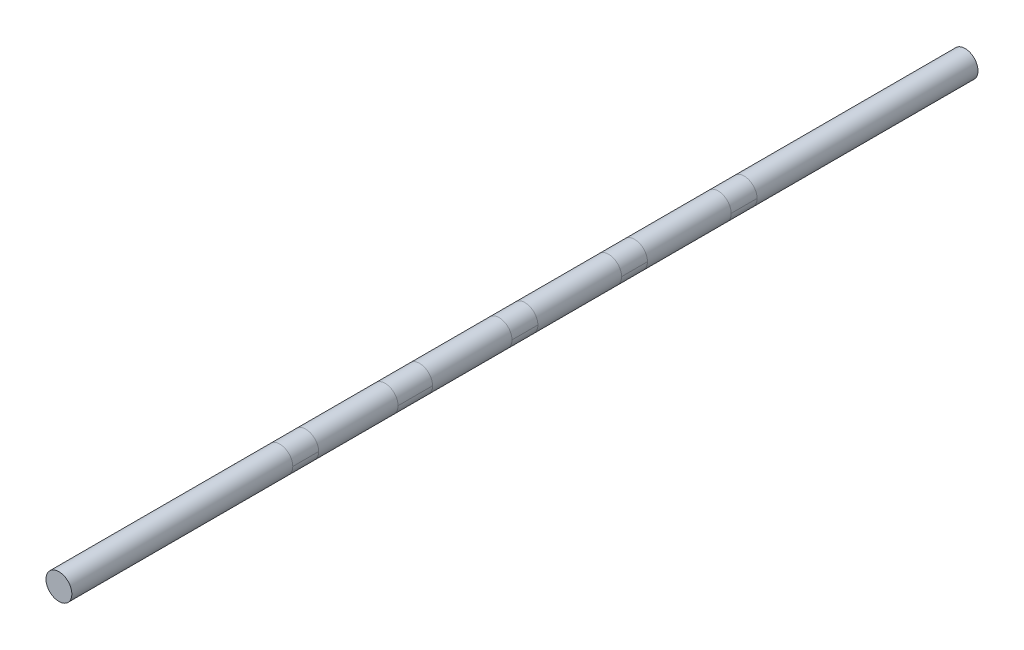
ISO-10303-21;
HEADER;
FILE_DESCRIPTION(('STEP AP214'),'2;1');
FILE_NAME('part.step','',(''),(''),'','','');
FILE_SCHEMA(('AUTOMOTIVE_DESIGN { 1 0 10303 214 1 1 1 1 }'));
ENDSEC;
DATA;
#1=APPLICATION_CONTEXT('core data for automotive mechanical design processes');
#2=APPLICATION_PROTOCOL_DEFINITION('international standard','automotive_design',2000,#1);
#3=PRODUCT_CONTEXT('',#1,'mechanical');
#4=PRODUCT('Part','Part','',(#3));
#5=PRODUCT_RELATED_PRODUCT_CATEGORY('part','',(#4));
#6=PRODUCT_DEFINITION_FORMATION('','',#4);
#7=PRODUCT_DEFINITION_CONTEXT('part definition',#1,'design');
#8=PRODUCT_DEFINITION('design','',#6,#7);
#9=PRODUCT_DEFINITION_SHAPE('','',#8);
#10=(LENGTH_UNIT() NAMED_UNIT(*) SI_UNIT(.MILLI.,.METRE.));
#11=(NAMED_UNIT(*) PLANE_ANGLE_UNIT() SI_UNIT($,.RADIAN.));
#12=(NAMED_UNIT(*) SI_UNIT($,.STERADIAN.) SOLID_ANGLE_UNIT());
#13=UNCERTAINTY_MEASURE_WITH_UNIT(LENGTH_MEASURE(1.E-05),#10,'distance_accuracy_value','');
#14=(GEOMETRIC_REPRESENTATION_CONTEXT(3) GLOBAL_UNCERTAINTY_ASSIGNED_CONTEXT((#13)) GLOBAL_UNIT_ASSIGNED_CONTEXT((#10,
#11,#12)) REPRESENTATION_CONTEXT('',''));
#15=CARTESIAN_POINT('',(0.,0.,0.));
#16=DIRECTION('',(0.,0.,1.));
#17=DIRECTION('',(1.,0.,0.));
#18=AXIS2_PLACEMENT_3D('',#15,#16,#17);
#19=CARTESIAN_POINT('',(0.,0.,1050.));
#20=DIRECTION('',(0.,0.,-1.));
#21=DIRECTION('',(-1.,0.,0.));
#22=AXIS2_PLACEMENT_3D('',#19,#20,#21);
#23=CYLINDRICAL_SURFACE('',#22,14.986);
#24=DIRECTION('',(0.,0.,-1.));
#25=VECTOR('',#24,1.);
#26=CARTESIAN_POINT('',(14.986,0.,1050.));
#27=LINE('',#26,#25);
#28=CARTESIAN_POINT('',(14.986,0.,286.));
#29=VERTEX_POINT('',#28);
#30=CARTESIAN_POINT('',(14.986,0.,256.));
#31=VERTEX_POINT('',#30);
#32=EDGE_CURVE('E11',#29,#31,#27,.T.);
#33=ORIENTED_EDGE('',*,*,#32,.F.);
#34=CARTESIAN_POINT('',(0.,0.,286.));
#35=DIRECTION('',(0.,0.,-1.));
#36=DIRECTION('',(-1.,0.,0.));
#37=AXIS2_PLACEMENT_3D('',#34,#35,#36);
#38=CIRCLE('',#37,14.986);
#39=CARTESIAN_POINT('',(-14.986,0.,286.));
#40=VERTEX_POINT('',#39);
#41=EDGE_CURVE('E50',#29,#40,#38,.T.);
#42=ORIENTED_EDGE('',*,*,#41,.T.);
#43=DIRECTION('',(0.,0.,-1.));
#44=VECTOR('',#43,1.);
#45=CARTESIAN_POINT('',(-14.9859999999999,0.,1050.));
#46=LINE('',#45,#44);
#47=CARTESIAN_POINT('',(-14.9859999999999,0.,256.));
#48=VERTEX_POINT('',#47);
#49=EDGE_CURVE('E207',#40,#48,#46,.T.);
#50=ORIENTED_EDGE('',*,*,#49,.T.);
#51=CARTESIAN_POINT('',(0.,0.,256.));
#52=DIRECTION('',(0.,0.,1.));
#53=DIRECTION('',(1.,0.,0.));
#54=AXIS2_PLACEMENT_3D('',#51,#52,#53);
#55=CIRCLE('',#54,14.986);
#56=EDGE_CURVE('E201',#48,#31,#55,.T.);
#57=ORIENTED_EDGE('',*,*,#56,.T.);
#58=EDGE_LOOP('',(#33,#42,#50,#57));
#59=FACE_BOUND('',#58,.T.);
#60=ADVANCED_FACE('F43',(#59),#23,.T.);
#61=CARTESIAN_POINT('',(0.,0.,0.));
#62=DIRECTION('',(0.,0.,1.));
#63=DIRECTION('',(1.,0.,0.));
#64=AXIS2_PLACEMENT_3D('',#61,#62,#63);
#65=CIRCLE('',#64,14.986);
#66=CARTESIAN_POINT('',(14.986,0.,0.));
#67=VERTEX_POINT('',#66);
#68=EDGE_CURVE('E149',#67,#67,#65,.T.);
#69=ORIENTED_EDGE('',*,*,#68,.T.);
#70=EDGE_LOOP('',(#69));
#71=FACE_BOUND('',#70,.T.);
#72=EDGE_CURVE('E52',#31,#48,#55,.T.);
#73=ORIENTED_EDGE('',*,*,#72,.F.);
#74=ORIENTED_EDGE('',*,*,#56,.F.);
#75=EDGE_LOOP('',(#73,#74));
#76=FACE_BOUND('',#75,.T.);
#77=ADVANCED_FACE('F226',(#71,#76),#23,.T.);
#78=CARTESIAN_POINT('',(0.,0.,383.));
#79=DIRECTION('',(0.,0.,1.));
#80=DIRECTION('',(1.,0.,0.));
#81=AXIS2_PLACEMENT_3D('',#78,#79,#80);
#82=CIRCLE('',#81,14.986);
#83=CARTESIAN_POINT('',(14.986,0.,383.));
#84=VERTEX_POINT('',#83);
#85=CARTESIAN_POINT('',(-14.986,0.,383.));
#86=VERTEX_POINT('',#85);
#87=EDGE_CURVE('E127',#84,#86,#82,.T.);
#88=ORIENTED_EDGE('',*,*,#87,.F.);
#89=EDGE_CURVE('E123',#86,#84,#82,.T.);
#90=ORIENTED_EDGE('',*,*,#89,.F.);
#91=EDGE_LOOP('',(#88,#90));
#92=FACE_BOUND('',#91,.T.);
#93=EDGE_CURVE('E209',#40,#29,#38,.T.);
#94=ORIENTED_EDGE('',*,*,#93,.F.);
#95=ORIENTED_EDGE('',*,*,#41,.F.);
#96=EDGE_LOOP('',(#94,#95));
#97=FACE_BOUND('',#96,.T.);
#98=ADVANCED_FACE('F222',(#92,#97),#23,.T.);
#99=DIRECTION('',(0.,0.,-1.));
#100=VECTOR('',#99,1.);
#101=CARTESIAN_POINT('',(14.986,0.,1050.));
#102=LINE('',#101,#100);
#103=CARTESIAN_POINT('',(14.986,0.,672.));
#104=VERTEX_POINT('',#103);
#105=CARTESIAN_POINT('',(14.986,0.,632.));
#106=VERTEX_POINT('',#105);
#107=EDGE_CURVE('E190',#104,#106,#102,.T.);
#108=ORIENTED_EDGE('',*,*,#107,.F.);
#109=CARTESIAN_POINT('',(0.,0.,672.));
#110=DIRECTION('',(0.,0.,-1.));
#111=DIRECTION('',(-1.,0.,0.));
#112=AXIS2_PLACEMENT_3D('',#109,#110,#111);
#113=CIRCLE('',#112,14.986);
#114=CARTESIAN_POINT('',(-14.986,0.,672.));
#115=VERTEX_POINT('',#114);
#116=EDGE_CURVE('E173',#104,#115,#113,.T.);
#117=ORIENTED_EDGE('',*,*,#116,.T.);
#118=DIRECTION('',(0.,0.,-1.));
#119=VECTOR('',#118,1.);
#120=CARTESIAN_POINT('',(-14.986,0.,1050.));
#121=LINE('',#120,#119);
#122=CARTESIAN_POINT('',(-14.986,0.,632.));
#123=VERTEX_POINT('',#122);
#124=EDGE_CURVE('E192',#115,#123,#121,.T.);
#125=ORIENTED_EDGE('',*,*,#124,.T.);
#126=CARTESIAN_POINT('',(0.,0.,632.));
#127=DIRECTION('',(0.,0.,1.));
#128=DIRECTION('',(1.,0.,0.));
#129=AXIS2_PLACEMENT_3D('',#126,#127,#128);
#130=CIRCLE('',#129,14.986);
#131=EDGE_CURVE('E194',#123,#106,#130,.T.);
#132=ORIENTED_EDGE('',*,*,#131,.T.);
#133=EDGE_LOOP('',(#108,#117,#125,#132));
#134=FACE_BOUND('',#133,.T.);
#135=ADVANCED_FACE('F227',(#134),#23,.T.);
#136=CARTESIAN_POINT('',(0.,0.,540.));
#137=DIRECTION('',(0.,0.,-1.));
#138=DIRECTION('',(-1.,0.,0.));
#139=AXIS2_PLACEMENT_3D('',#136,#137,#138);
#140=CIRCLE('',#139,14.986);
#141=CARTESIAN_POINT('',(-14.986,0.,540.));
#142=VERTEX_POINT('',#141);
#143=CARTESIAN_POINT('',(14.986,0.,540.));
#144=VERTEX_POINT('',#143);
#145=EDGE_CURVE('E158',#142,#144,#140,.T.);
#146=ORIENTED_EDGE('',*,*,#145,.F.);
#147=EDGE_CURVE('E128',#144,#142,#140,.T.);
#148=ORIENTED_EDGE('',*,*,#147,.F.);
#149=EDGE_LOOP('',(#146,#148));
#150=FACE_BOUND('',#149,.T.);
#151=EDGE_CURVE('E188',#106,#123,#130,.T.);
#152=ORIENTED_EDGE('',*,*,#151,.F.);
#153=ORIENTED_EDGE('',*,*,#131,.F.);
#154=EDGE_LOOP('',(#152,#153));
#155=FACE_BOUND('',#154,.T.);
#156=ADVANCED_FACE('F234',(#150,#155),#23,.T.);
#157=CARTESIAN_POINT('',(0.,0.,764.));
#158=DIRECTION('',(0.,0.,1.));
#159=DIRECTION('',(1.,0.,0.));
#160=AXIS2_PLACEMENT_3D('',#157,#158,#159);
#161=CIRCLE('',#160,14.986);
#162=CARTESIAN_POINT('',(14.986,0.,764.));
#163=VERTEX_POINT('',#162);
#164=CARTESIAN_POINT('',(-14.986,0.,764.));
#165=VERTEX_POINT('',#164);
#166=EDGE_CURVE('E172',#163,#165,#161,.T.);
#167=ORIENTED_EDGE('',*,*,#166,.F.);
#168=EDGE_CURVE('E174',#165,#163,#161,.T.);
#169=ORIENTED_EDGE('',*,*,#168,.F.);
#170=EDGE_LOOP('',(#167,#169));
#171=FACE_BOUND('',#170,.T.);
#172=EDGE_CURVE('E197',#115,#104,#113,.T.);
#173=ORIENTED_EDGE('',*,*,#172,.F.);
#174=ORIENTED_EDGE('',*,*,#116,.F.);
#175=EDGE_LOOP('',(#173,#174));
#176=FACE_BOUND('',#175,.T.);
#177=ADVANCED_FACE('F311',(#171,#176),#23,.T.);
#178=DIRECTION('',(0.,0.,-1.));
#179=VECTOR('',#178,1.);
#180=CARTESIAN_POINT('',(14.986,0.,1050.));
#181=LINE('',#180,#179);
#182=CARTESIAN_POINT('',(14.986,0.,794.));
#183=VERTEX_POINT('',#182);
#184=EDGE_CURVE('E167',#183,#163,#181,.T.);
#185=ORIENTED_EDGE('',*,*,#184,.F.);
#186=CARTESIAN_POINT('',(0.,0.,794.));
#187=DIRECTION('',(0.,0.,-1.));
#188=DIRECTION('',(-1.,0.,0.));
#189=AXIS2_PLACEMENT_3D('',#186,#187,#188);
#190=CIRCLE('',#189,14.986);
#191=CARTESIAN_POINT('',(-14.986,0.,794.));
#192=VERTEX_POINT('',#191);
#193=EDGE_CURVE('E169',#183,#192,#190,.T.);
#194=ORIENTED_EDGE('',*,*,#193,.T.);
#195=DIRECTION('',(0.,0.,-1.));
#196=VECTOR('',#195,1.);
#197=CARTESIAN_POINT('',(-14.986,0.,1050.));
#198=LINE('',#197,#196);
#199=EDGE_CURVE('E177',#192,#165,#198,.T.);
#200=ORIENTED_EDGE('',*,*,#199,.T.);
#201=ORIENTED_EDGE('',*,*,#168,.T.);
#202=EDGE_LOOP('',(#185,#194,#200,#201));
#203=FACE_BOUND('',#202,.T.);
#204=ADVANCED_FACE('F299',(#203),#23,.T.);
#205=ORIENTED_EDGE('',*,*,#172,.T.);
#206=ORIENTED_EDGE('',*,*,#107,.T.);
#207=ORIENTED_EDGE('',*,*,#151,.T.);
#208=ORIENTED_EDGE('',*,*,#124,.F.);
#209=EDGE_LOOP('',(#205,#206,#207,#208));
#210=FACE_BOUND('',#209,.T.);
#211=ADVANCED_FACE('F295',(#210),#23,.T.);
#212=CARTESIAN_POINT('',(0.,0.,1050.));
#213=DIRECTION('',(0.,0.,1.));
#214=DIRECTION('',(1.,0.,0.));
#215=AXIS2_PLACEMENT_3D('',#212,#213,#214);
#216=CIRCLE('',#215,14.986);
#217=CARTESIAN_POINT('',(14.986,0.,1050.));
#218=VERTEX_POINT('',#217);
#219=EDGE_CURVE('E142',#218,#218,#216,.T.);
#220=ORIENTED_EDGE('',*,*,#219,.F.);
#221=EDGE_LOOP('',(#220));
#222=FACE_BOUND('',#221,.T.);
#223=EDGE_CURVE('E182',#192,#183,#190,.T.);
#224=ORIENTED_EDGE('',*,*,#223,.F.);
#225=ORIENTED_EDGE('',*,*,#193,.F.);
#226=EDGE_LOOP('',(#224,#225));
#227=FACE_BOUND('',#226,.T.);
#228=ADVANCED_FACE('F287',(#222,#227),#23,.T.);
#229=DIRECTION('',(0.,0.,-1.));
#230=VECTOR('',#229,1.);
#231=CARTESIAN_POINT('',(14.986,0.,1050.));
#232=LINE('',#231,#230);
#233=CARTESIAN_POINT('',(14.986,0.,510.));
#234=VERTEX_POINT('',#233);
#235=EDGE_CURVE('E168',#144,#234,#232,.T.);
#236=ORIENTED_EDGE('',*,*,#235,.F.);
#237=ORIENTED_EDGE('',*,*,#147,.T.);
#238=DIRECTION('',(0.,0.,-1.));
#239=VECTOR('',#238,1.);
#240=CARTESIAN_POINT('',(-14.986,0.,1050.));
#241=LINE('',#240,#239);
#242=CARTESIAN_POINT('',(-14.986,0.,510.));
#243=VERTEX_POINT('',#242);
#244=EDGE_CURVE('E160',#142,#243,#241,.T.);
#245=ORIENTED_EDGE('',*,*,#244,.T.);
#246=CARTESIAN_POINT('',(0.,0.,510.));
#247=DIRECTION('',(0.,0.,1.));
#248=DIRECTION('',(1.,0.,0.));
#249=AXIS2_PLACEMENT_3D('',#246,#247,#248);
#250=CIRCLE('',#249,14.986);
#251=EDGE_CURVE('E163',#243,#234,#250,.T.);
#252=ORIENTED_EDGE('',*,*,#251,.T.);
#253=EDGE_LOOP('',(#236,#237,#245,#252));
#254=FACE_BOUND('',#253,.T.);
#255=ADVANCED_FACE('F262',(#254),#23,.T.);
#256=CARTESIAN_POINT('',(0.,0.,413.));
#257=DIRECTION('',(0.,0.,-1.));
#258=DIRECTION('',(-1.,0.,0.));
#259=AXIS2_PLACEMENT_3D('',#256,#257,#258);
#260=CIRCLE('',#259,14.986);
#261=CARTESIAN_POINT('',(-14.986,0.,413.));
#262=VERTEX_POINT('',#261);
#263=CARTESIAN_POINT('',(14.986,0.,413.));
#264=VERTEX_POINT('',#263);
#265=EDGE_CURVE('E131',#262,#264,#260,.T.);
#266=ORIENTED_EDGE('',*,*,#265,.F.);
#267=EDGE_CURVE('E124',#264,#262,#260,.T.);
#268=ORIENTED_EDGE('',*,*,#267,.F.);
#269=EDGE_LOOP('',(#266,#268));
#270=FACE_BOUND('',#269,.T.);
#271=EDGE_CURVE('E164',#234,#243,#250,.T.);
#272=ORIENTED_EDGE('',*,*,#271,.F.);
#273=ORIENTED_EDGE('',*,*,#251,.F.);
#274=EDGE_LOOP('',(#272,#273));
#275=FACE_BOUND('',#274,.T.);
#276=ADVANCED_FACE('F136',(#270,#275),#23,.T.);
#277=ORIENTED_EDGE('',*,*,#223,.T.);
#278=ORIENTED_EDGE('',*,*,#184,.T.);
#279=ORIENTED_EDGE('',*,*,#166,.T.);
#280=ORIENTED_EDGE('',*,*,#199,.F.);
#281=EDGE_LOOP('',(#277,#278,#279,#280));
#282=FACE_BOUND('',#281,.T.);
#283=ADVANCED_FACE('F282',(#282),#23,.T.);
#284=DIRECTION('',(0.,0.,-1.));
#285=VECTOR('',#284,1.);
#286=CARTESIAN_POINT('',(14.986,0.,1050.));
#287=LINE('',#286,#285);
#288=EDGE_CURVE('E117',#264,#84,#287,.T.);
#289=ORIENTED_EDGE('',*,*,#288,.F.);
#290=ORIENTED_EDGE('',*,*,#267,.T.);
#291=DIRECTION('',(0.,0.,-1.));
#292=VECTOR('',#291,1.);
#293=CARTESIAN_POINT('',(-14.986,0.,1050.));
#294=LINE('',#293,#292);
#295=EDGE_CURVE('E132',#262,#86,#294,.T.);
#296=ORIENTED_EDGE('',*,*,#295,.T.);
#297=ORIENTED_EDGE('',*,*,#89,.T.);
#298=EDGE_LOOP('',(#289,#290,#296,#297));
#299=FACE_BOUND('',#298,.T.);
#300=ADVANCED_FACE('F119',(#299),#23,.T.);
#301=ORIENTED_EDGE('',*,*,#93,.T.);
#302=ORIENTED_EDGE('',*,*,#32,.T.);
#303=ORIENTED_EDGE('',*,*,#72,.T.);
#304=ORIENTED_EDGE('',*,*,#49,.F.);
#305=EDGE_LOOP('',(#301,#302,#303,#304));
#306=FACE_BOUND('',#305,.T.);
#307=ADVANCED_FACE('F252',(#306),#23,.T.);
#308=ORIENTED_EDGE('',*,*,#145,.T.);
#309=ORIENTED_EDGE('',*,*,#235,.T.);
#310=ORIENTED_EDGE('',*,*,#271,.T.);
#311=ORIENTED_EDGE('',*,*,#244,.F.);
#312=EDGE_LOOP('',(#308,#309,#310,#311));
#313=FACE_BOUND('',#312,.T.);
#314=ADVANCED_FACE('F243',(#313),#23,.T.);
#315=ORIENTED_EDGE('',*,*,#265,.T.);
#316=ORIENTED_EDGE('',*,*,#288,.T.);
#317=ORIENTED_EDGE('',*,*,#87,.T.);
#318=ORIENTED_EDGE('',*,*,#295,.F.);
#319=EDGE_LOOP('',(#315,#316,#317,#318));
#320=FACE_BOUND('',#319,.T.);
#321=ADVANCED_FACE('F44',(#320),#23,.T.);
#322=CARTESIAN_POINT('',(0.,0.,1050.));
#323=DIRECTION('',(0.,0.,1.));
#324=DIRECTION('',(1.,0.,0.));
#325=AXIS2_PLACEMENT_3D('',#322,#323,#324);
#326=PLANE('',#325);
#327=ORIENTED_EDGE('',*,*,#219,.T.);
#328=EDGE_LOOP('',(#327));
#329=FACE_BOUND('',#328,.T.);
#330=ADVANCED_FACE('F245',(#329),#326,.T.);
#331=CARTESIAN_POINT('',(0.,0.,0.));
#332=DIRECTION('',(0.,0.,1.));
#333=DIRECTION('',(1.,0.,0.));
#334=AXIS2_PLACEMENT_3D('',#331,#332,#333);
#335=PLANE('',#334);
#336=ORIENTED_EDGE('',*,*,#68,.F.);
#337=EDGE_LOOP('',(#336));
#338=FACE_BOUND('',#337,.T.);
#339=ADVANCED_FACE('F247',(#338),#335,.F.);
#340=CLOSED_SHELL('',(#60,#77,#98,#135,#156,#177,#204,#211,#228,#255,#276,#283,#300,#307,#314,
#321,#330,#339));
#341=MANIFOLD_SOLID_BREP('B2',#340);
#342=ADVANCED_BREP_SHAPE_REPRESENTATION('',(#18,#341),#14);
#343=SHAPE_DEFINITION_REPRESENTATION(#9,#342);
ENDSEC;
END-ISO-10303-21;
